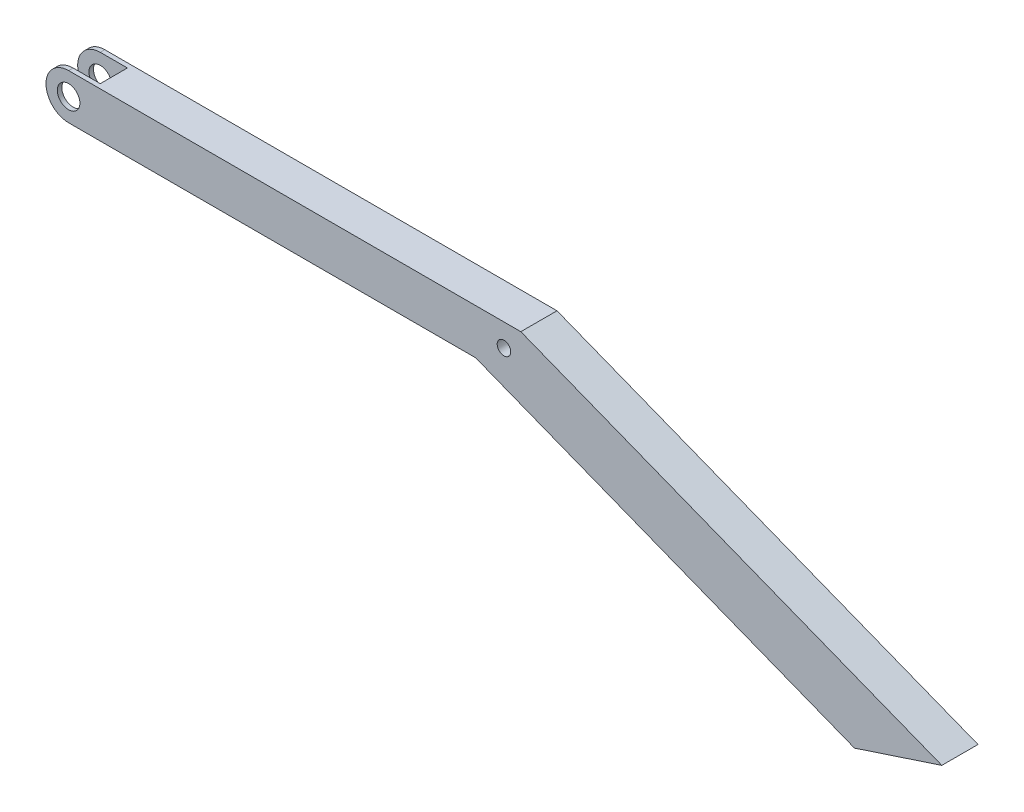
ISO-10303-21;
HEADER;
FILE_DESCRIPTION(('STEP AP214'),'2;1');
FILE_NAME('part.step','',(''),(''),'','','');
FILE_SCHEMA(('AUTOMOTIVE_DESIGN { 1 0 10303 214 1 1 1 1 }'));
ENDSEC;
DATA;
#1=APPLICATION_CONTEXT('core data for automotive mechanical design processes');
#2=APPLICATION_PROTOCOL_DEFINITION('international standard','automotive_design',2000,#1);
#3=PRODUCT_CONTEXT('',#1,'mechanical');
#4=PRODUCT('Part','Part','',(#3));
#5=PRODUCT_RELATED_PRODUCT_CATEGORY('part','',(#4));
#6=PRODUCT_DEFINITION_FORMATION('','',#4);
#7=PRODUCT_DEFINITION_CONTEXT('part definition',#1,'design');
#8=PRODUCT_DEFINITION('design','',#6,#7);
#9=PRODUCT_DEFINITION_SHAPE('','',#8);
#10=(LENGTH_UNIT() NAMED_UNIT(*) SI_UNIT(.MILLI.,.METRE.));
#11=(NAMED_UNIT(*) PLANE_ANGLE_UNIT() SI_UNIT($,.RADIAN.));
#12=(NAMED_UNIT(*) SI_UNIT($,.STERADIAN.) SOLID_ANGLE_UNIT());
#13=UNCERTAINTY_MEASURE_WITH_UNIT(LENGTH_MEASURE(1.E-05),#10,'distance_accuracy_value','');
#14=(GEOMETRIC_REPRESENTATION_CONTEXT(3) GLOBAL_UNCERTAINTY_ASSIGNED_CONTEXT((#13)) GLOBAL_UNIT_ASSIGNED_CONTEXT((#10,
#11,#12)) REPRESENTATION_CONTEXT('',''));
#15=CARTESIAN_POINT('',(0.,0.,0.));
#16=DIRECTION('',(0.,0.,1.));
#17=DIRECTION('',(1.,0.,0.));
#18=AXIS2_PLACEMENT_3D('',#15,#16,#17);
#19=CARTESIAN_POINT('',(-83.2313575525812,9.56022944550669,4.));
#20=DIRECTION('',(0.,0.,-1.));
#21=DIRECTION('',(-1.,0.,0.));
#22=AXIS2_PLACEMENT_3D('',#19,#20,#21);
#23=CYLINDRICAL_SURFACE('',#22,5.);
#24=CARTESIAN_POINT('',(-83.2313575525812,9.56022944550669,-3.));
#25=DIRECTION('',(0.,0.,1.));
#26=DIRECTION('',(1.,0.,0.));
#27=AXIS2_PLACEMENT_3D('',#24,#25,#26);
#28=CIRCLE('',#27,5.);
#29=CARTESIAN_POINT('',(-83.2313575525812,14.5602294455067,-3.));
#30=VERTEX_POINT('',#29);
#31=CARTESIAN_POINT('',(-83.2313575525812,4.56022944550669,-3.));
#32=VERTEX_POINT('',#31);
#33=EDGE_CURVE('E225',#30,#32,#28,.T.);
#34=ORIENTED_EDGE('',*,*,#33,.F.);
#35=DIRECTION('',(0.,0.,-1.));
#36=VECTOR('',#35,1.);
#37=CARTESIAN_POINT('',(-83.2313575525812,14.5602294455067,4.));
#38=LINE('',#37,#36);
#39=CARTESIAN_POINT('',(-83.2313575525812,14.5602294455067,-4.));
#40=VERTEX_POINT('',#39);
#41=EDGE_CURVE('E93',#30,#40,#38,.T.);
#42=ORIENTED_EDGE('',*,*,#41,.T.);
#43=CARTESIAN_POINT('',(-83.2313575525812,9.56022944550669,-4.));
#44=DIRECTION('',(0.,0.,1.));
#45=DIRECTION('',(1.,0.,0.));
#46=AXIS2_PLACEMENT_3D('',#43,#44,#45);
#47=CIRCLE('',#46,5.);
#48=CARTESIAN_POINT('',(-83.2313575525812,4.56022944550669,-4.));
#49=VERTEX_POINT('',#48);
#50=EDGE_CURVE('E141',#40,#49,#47,.T.);
#51=ORIENTED_EDGE('',*,*,#50,.T.);
#52=DIRECTION('',(0.,0.,-1.));
#53=VECTOR('',#52,1.);
#54=CARTESIAN_POINT('',(-83.2313575525812,4.56022944550669,4.));
#55=LINE('',#54,#53);
#56=EDGE_CURVE('E48',#32,#49,#55,.T.);
#57=ORIENTED_EDGE('',*,*,#56,.F.);
#58=EDGE_LOOP('',(#34,#42,#51,#57));
#59=FACE_BOUND('',#58,.T.);
#60=ADVANCED_FACE('F39',(#59),#23,.T.);
#61=CARTESIAN_POINT('',(-43.2313575525813,4.56022944550669,4.));
#62=DIRECTION('',(0.,1.,0.));
#63=DIRECTION('',(0.,0.,1.));
#64=AXIS2_PLACEMENT_3D('',#61,#62,#63);
#65=PLANE('',#64);
#66=DIRECTION('',(1.,0.,0.));
#67=VECTOR('',#66,1.);
#68=CARTESIAN_POINT('',(-83.2313575525812,4.56022944550669,-3.));
#69=LINE('',#68,#67);
#70=CARTESIAN_POINT('',(-77.2313575525813,4.5602294455067,-3.));
#71=VERTEX_POINT('',#70);
#72=EDGE_CURVE('E232',#32,#71,#69,.T.);
#73=ORIENTED_EDGE('',*,*,#72,.F.);
#74=ORIENTED_EDGE('',*,*,#56,.T.);
#75=DIRECTION('',(1.,0.,0.));
#76=VECTOR('',#75,1.);
#77=CARTESIAN_POINT('',(-43.2313575525813,4.56022944550669,-4.));
#78=LINE('',#77,#76);
#79=CARTESIAN_POINT('',(6.76864244741875,4.56022944550669,-4.));
#80=VERTEX_POINT('',#79);
#81=EDGE_CURVE('E143',#49,#80,#78,.T.);
#82=ORIENTED_EDGE('',*,*,#81,.T.);
#83=DIRECTION('',(0.,0.,-1.));
#84=VECTOR('',#83,1.);
#85=CARTESIAN_POINT('',(6.76864244741875,4.56022944550669,4.));
#86=LINE('',#85,#84);
#87=CARTESIAN_POINT('',(6.76864244741875,4.56022944550669,4.));
#88=VERTEX_POINT('',#87);
#89=EDGE_CURVE('E159',#88,#80,#86,.T.);
#90=ORIENTED_EDGE('',*,*,#89,.F.);
#91=DIRECTION('',(1.,0.,0.));
#92=VECTOR('',#91,1.);
#93=CARTESIAN_POINT('',(-83.2313575525812,4.56022944550669,4.));
#94=LINE('',#93,#92);
#95=CARTESIAN_POINT('',(-83.2313575525812,4.56022944550669,4.));
#96=VERTEX_POINT('',#95);
#97=EDGE_CURVE('E101',#96,#88,#94,.T.);
#98=ORIENTED_EDGE('',*,*,#97,.F.);
#99=CARTESIAN_POINT('',(-83.2313575525812,4.56022944550669,3.));
#100=VERTEX_POINT('',#99);
#101=EDGE_CURVE('E11',#96,#100,#55,.T.);
#102=ORIENTED_EDGE('',*,*,#101,.T.);
#103=DIRECTION('',(1.,0.,0.));
#104=VECTOR('',#103,1.);
#105=CARTESIAN_POINT('',(-83.2313575525812,4.56022944550669,3.));
#106=LINE('',#105,#104);
#107=CARTESIAN_POINT('',(-77.2313575525813,4.5602294455067,3.));
#108=VERTEX_POINT('',#107);
#109=EDGE_CURVE('E210',#100,#108,#106,.T.);
#110=ORIENTED_EDGE('',*,*,#109,.T.);
#111=DIRECTION('',(0.,0.,1.));
#112=VECTOR('',#111,1.);
#113=CARTESIAN_POINT('',(-77.2313575525813,4.5602294455067,-3.));
#114=LINE('',#113,#112);
#115=EDGE_CURVE('E169',#71,#108,#114,.T.);
#116=ORIENTED_EDGE('',*,*,#115,.F.);
#117=EDGE_LOOP('',(#73,#74,#82,#90,#98,#102,#110,#116));
#118=FACE_BOUND('',#117,.T.);
#119=ADVANCED_FACE('F195',(#118),#65,.F.);
#120=CARTESIAN_POINT('',(-83.2313575525812,14.5602294455067,4.));
#121=DIRECTION('',(0.,-1.,0.));
#122=DIRECTION('',(0.,0.,-1.));
#123=AXIS2_PLACEMENT_3D('',#120,#121,#122);
#124=PLANE('',#123);
#125=DIRECTION('',(-1.,0.,0.));
#126=VECTOR('',#125,1.);
#127=CARTESIAN_POINT('',(-83.2313575525812,14.5602294455067,-3.));
#128=LINE('',#127,#126);
#129=CARTESIAN_POINT('',(-77.2313575525813,14.5602294455067,-3.));
#130=VERTEX_POINT('',#129);
#131=EDGE_CURVE('E175',#130,#30,#128,.T.);
#132=ORIENTED_EDGE('',*,*,#131,.F.);
#133=DIRECTION('',(0.,0.,1.));
#134=VECTOR('',#133,1.);
#135=CARTESIAN_POINT('',(-77.2313575525813,14.5602294455067,-3.));
#136=LINE('',#135,#134);
#137=CARTESIAN_POINT('',(-77.2313575525813,14.5602294455067,3.));
#138=VERTEX_POINT('',#137);
#139=EDGE_CURVE('E163',#130,#138,#136,.T.);
#140=ORIENTED_EDGE('',*,*,#139,.T.);
#141=DIRECTION('',(-1.,0.,0.));
#142=VECTOR('',#141,1.);
#143=CARTESIAN_POINT('',(-83.2313575525812,14.5602294455067,3.));
#144=LINE('',#143,#142);
#145=CARTESIAN_POINT('',(-83.2313575525812,14.5602294455067,3.));
#146=VERTEX_POINT('',#145);
#147=EDGE_CURVE('E178',#138,#146,#144,.T.);
#148=ORIENTED_EDGE('',*,*,#147,.T.);
#149=CARTESIAN_POINT('',(-83.2313575525812,14.5602294455067,4.));
#150=VERTEX_POINT('',#149);
#151=EDGE_CURVE('E154',#150,#146,#38,.T.);
#152=ORIENTED_EDGE('',*,*,#151,.F.);
#153=DIRECTION('',(-1.,0.,0.));
#154=VECTOR('',#153,1.);
#155=CARTESIAN_POINT('',(-43.2313575525813,14.5602294455067,4.));
#156=LINE('',#155,#154);
#157=CARTESIAN_POINT('',(16.7686424474187,14.5602294455067,4.));
#158=VERTEX_POINT('',#157);
#159=EDGE_CURVE('E65',#158,#150,#156,.T.);
#160=ORIENTED_EDGE('',*,*,#159,.F.);
#161=DIRECTION('',(0.,0.,-1.));
#162=VECTOR('',#161,1.);
#163=CARTESIAN_POINT('',(16.7686424474187,14.5602294455067,4.));
#164=LINE('',#163,#162);
#165=CARTESIAN_POINT('',(16.7686424474187,14.5602294455067,-4.));
#166=VERTEX_POINT('',#165);
#167=EDGE_CURVE('E133',#158,#166,#164,.T.);
#168=ORIENTED_EDGE('',*,*,#167,.T.);
#169=DIRECTION('',(-1.,0.,0.));
#170=VECTOR('',#169,1.);
#171=CARTESIAN_POINT('',(-83.2313575525812,14.5602294455067,-4.));
#172=LINE('',#171,#170);
#173=EDGE_CURVE('E151',#166,#40,#172,.T.);
#174=ORIENTED_EDGE('',*,*,#173,.T.);
#175=ORIENTED_EDGE('',*,*,#41,.F.);
#176=EDGE_LOOP('',(#132,#140,#148,#152,#160,#168,#174,#175));
#177=FACE_BOUND('',#176,.T.);
#178=ADVANCED_FACE('F204',(#177),#124,.F.);
#179=CARTESIAN_POINT('',(-83.2313575525812,9.56022944550669,4.));
#180=DIRECTION('',(0.,0.,-1.));
#181=DIRECTION('',(-1.,0.,0.));
#182=AXIS2_PLACEMENT_3D('',#179,#180,#181);
#183=CYLINDRICAL_SURFACE('',#182,2.49999999999999);
#184=CARTESIAN_POINT('',(-83.2313575525812,9.56022944550669,-4.));
#185=DIRECTION('',(0.,0.,1.));
#186=DIRECTION('',(1.,0.,0.));
#187=AXIS2_PLACEMENT_3D('',#184,#185,#186);
#188=CIRCLE('',#187,2.49999999999999);
#189=CARTESIAN_POINT('',(-80.7313575525813,9.56022944550669,-4.));
#190=VERTEX_POINT('',#189);
#191=EDGE_CURVE('E167',#190,#190,#188,.T.);
#192=ORIENTED_EDGE('',*,*,#191,.F.);
#193=EDGE_LOOP('',(#192));
#194=FACE_BOUND('',#193,.T.);
#195=CARTESIAN_POINT('',(-83.2313575525812,9.56022944550669,-3.));
#196=DIRECTION('',(0.,0.,1.));
#197=DIRECTION('',(1.,0.,0.));
#198=AXIS2_PLACEMENT_3D('',#195,#196,#197);
#199=CIRCLE('',#198,2.49999999999999);
#200=CARTESIAN_POINT('',(-80.7313575525813,9.56022944550669,-3.));
#201=VERTEX_POINT('',#200);
#202=EDGE_CURVE('E43',#201,#201,#199,.T.);
#203=ORIENTED_EDGE('',*,*,#202,.T.);
#204=EDGE_LOOP('',(#203));
#205=FACE_BOUND('',#204,.T.);
#206=ADVANCED_FACE('F259',(#194,#205),#183,.F.);
#207=CARTESIAN_POINT('',(-83.2313575525812,9.56022944550669,4.));
#208=DIRECTION('',(0.,0.,1.));
#209=DIRECTION('',(1.,0.,0.));
#210=AXIS2_PLACEMENT_3D('',#207,#208,#209);
#211=PLANE('',#210);
#212=CARTESIAN_POINT('',(13.0411471268133,9.56022944550669,4.));
#213=DIRECTION('',(0.,0.,1.));
#214=DIRECTION('',(1.,0.,0.));
#215=AXIS2_PLACEMENT_3D('',#212,#213,#214);
#216=CIRCLE('',#215,1.5);
#217=CARTESIAN_POINT('',(14.5411471268133,9.56022944550669,4.));
#218=VERTEX_POINT('',#217);
#219=EDGE_CURVE('E144',#218,#218,#216,.T.);
#220=ORIENTED_EDGE('',*,*,#219,.F.);
#221=EDGE_LOOP('',(#220));
#222=FACE_BOUND('',#221,.T.);
#223=CARTESIAN_POINT('',(-83.2313575525812,9.56022944550669,4.));
#224=DIRECTION('',(0.,0.,1.));
#225=DIRECTION('',(1.,0.,0.));
#226=AXIS2_PLACEMENT_3D('',#223,#224,#225);
#227=CIRCLE('',#226,5.);
#228=EDGE_CURVE('E153',#150,#96,#227,.T.);
#229=ORIENTED_EDGE('',*,*,#228,.T.);
#230=ORIENTED_EDGE('',*,*,#97,.T.);
#231=DIRECTION('',(0.930964273643458,-0.365110286351274,0.));
#232=VECTOR('',#231,1.);
#233=CARTESIAN_POINT('',(6.76864244741875,4.56022944550669,4.));
#234=LINE('',#233,#232);
#235=CARTESIAN_POINT('',(90.5554270753299,-28.299696326108,4.));
#236=VERTEX_POINT('',#235);
#237=EDGE_CURVE('E119',#88,#236,#234,.T.);
#238=ORIENTED_EDGE('',*,*,#237,.T.);
#239=DIRECTION('',(0.949968991420898,0.312344225717014,0.));
#240=VECTOR('',#239,1.);
#241=CARTESIAN_POINT('',(109.865069811765,-21.9507991896207,4.));
#242=LINE('',#241,#240);
#243=CARTESIAN_POINT('',(109.865069811765,-21.9507991896207,4.));
#244=VERTEX_POINT('',#243);
#245=EDGE_CURVE('E111',#236,#244,#242,.T.);
#246=ORIENTED_EDGE('',*,*,#245,.T.);
#247=DIRECTION('',(-0.930964273643458,0.365110286351274,0.));
#248=VECTOR('',#247,1.);
#249=CARTESIAN_POINT('',(16.7686424474187,14.5602294455067,4.));
#250=LINE('',#249,#248);
#251=EDGE_CURVE('E116',#244,#158,#250,.T.);
#252=ORIENTED_EDGE('',*,*,#251,.T.);
#253=ORIENTED_EDGE('',*,*,#159,.T.);
#254=EDGE_LOOP('',(#229,#230,#238,#246,#252,#253));
#255=FACE_BOUND('',#254,.T.);
#256=CARTESIAN_POINT('',(-83.2313575525812,9.56022944550669,4.));
#257=DIRECTION('',(0.,0.,1.));
#258=DIRECTION('',(1.,0.,0.));
#259=AXIS2_PLACEMENT_3D('',#256,#257,#258);
#260=CIRCLE('',#259,2.49999999999999);
#261=CARTESIAN_POINT('',(-80.7313575525813,9.56022944550669,4.));
#262=VERTEX_POINT('',#261);
#263=EDGE_CURVE('E181',#262,#262,#260,.T.);
#264=ORIENTED_EDGE('',*,*,#263,.F.);
#265=EDGE_LOOP('',(#264));
#266=FACE_BOUND('',#265,.T.);
#267=ADVANCED_FACE('F113',(#222,#255,#266),#211,.T.);
#268=CARTESIAN_POINT('',(-83.2313575525812,9.56022944550669,-4.));
#269=DIRECTION('',(0.,0.,1.));
#270=DIRECTION('',(1.,0.,0.));
#271=AXIS2_PLACEMENT_3D('',#268,#269,#270);
#272=PLANE('',#271);
#273=ORIENTED_EDGE('',*,*,#50,.F.);
#274=ORIENTED_EDGE('',*,*,#173,.F.);
#275=DIRECTION('',(-0.930964273643458,0.365110286351274,0.));
#276=VECTOR('',#275,1.);
#277=CARTESIAN_POINT('',(16.7686424474187,14.5602294455067,-4.));
#278=LINE('',#277,#276);
#279=CARTESIAN_POINT('',(109.865069811765,-21.9507991896207,-4.));
#280=VERTEX_POINT('',#279);
#281=EDGE_CURVE('E149',#280,#166,#278,.T.);
#282=ORIENTED_EDGE('',*,*,#281,.F.);
#283=DIRECTION('',(0.949968991420898,0.312344225717014,0.));
#284=VECTOR('',#283,1.);
#285=CARTESIAN_POINT('',(109.865069811765,-21.9507991896207,-4.));
#286=LINE('',#285,#284);
#287=CARTESIAN_POINT('',(90.5554270753299,-28.299696326108,-4.));
#288=VERTEX_POINT('',#287);
#289=EDGE_CURVE('E128',#288,#280,#286,.T.);
#290=ORIENTED_EDGE('',*,*,#289,.F.);
#291=DIRECTION('',(0.930964273643458,-0.365110286351274,0.));
#292=VECTOR('',#291,1.);
#293=CARTESIAN_POINT('',(6.76864244741875,4.56022944550669,-4.));
#294=LINE('',#293,#292);
#295=EDGE_CURVE('E146',#80,#288,#294,.T.);
#296=ORIENTED_EDGE('',*,*,#295,.F.);
#297=ORIENTED_EDGE('',*,*,#81,.F.);
#298=EDGE_LOOP('',(#273,#274,#282,#290,#296,#297));
#299=FACE_BOUND('',#298,.T.);
#300=CARTESIAN_POINT('',(13.0411471268133,9.56022944550669,-4.));
#301=DIRECTION('',(0.,0.,1.));
#302=DIRECTION('',(1.,0.,0.));
#303=AXIS2_PLACEMENT_3D('',#300,#301,#302);
#304=CIRCLE('',#303,1.5);
#305=CARTESIAN_POINT('',(14.5411471268133,9.56022944550669,-4.));
#306=VERTEX_POINT('',#305);
#307=EDGE_CURVE('E184',#306,#306,#304,.T.);
#308=ORIENTED_EDGE('',*,*,#307,.T.);
#309=EDGE_LOOP('',(#308));
#310=FACE_BOUND('',#309,.T.);
#311=ORIENTED_EDGE('',*,*,#191,.T.);
#312=EDGE_LOOP('',(#311));
#313=FACE_BOUND('',#312,.T.);
#314=ADVANCED_FACE('F202',(#299,#310,#313),#272,.F.);
#315=ORIENTED_EDGE('',*,*,#151,.T.);
#316=CARTESIAN_POINT('',(-83.2313575525812,9.56022944550669,3.));
#317=DIRECTION('',(0.,0.,1.));
#318=DIRECTION('',(1.,0.,0.));
#319=AXIS2_PLACEMENT_3D('',#316,#317,#318);
#320=CIRCLE('',#319,5.);
#321=EDGE_CURVE('E56',#146,#100,#320,.T.);
#322=ORIENTED_EDGE('',*,*,#321,.T.);
#323=ORIENTED_EDGE('',*,*,#101,.F.);
#324=ORIENTED_EDGE('',*,*,#228,.F.);
#325=EDGE_LOOP('',(#315,#322,#323,#324));
#326=FACE_BOUND('',#325,.T.);
#327=ADVANCED_FACE('F41',(#326),#23,.T.);
#328=CARTESIAN_POINT('',(6.76864244741875,4.56022944550669,4.));
#329=DIRECTION('',(0.365110286351274,0.930964273643458,0.));
#330=DIRECTION('',(-0.930964273643458,0.365110286351274,0.));
#331=AXIS2_PLACEMENT_3D('',#328,#329,#330);
#332=PLANE('',#331);
#333=ORIENTED_EDGE('',*,*,#295,.T.);
#334=DIRECTION('',(0.,0.,-1.));
#335=VECTOR('',#334,1.);
#336=CARTESIAN_POINT('',(90.5554270753299,-28.299696326108,4.));
#337=LINE('',#336,#335);
#338=EDGE_CURVE('E132',#236,#288,#337,.T.);
#339=ORIENTED_EDGE('',*,*,#338,.F.);
#340=ORIENTED_EDGE('',*,*,#237,.F.);
#341=ORIENTED_EDGE('',*,*,#89,.T.);
#342=EDGE_LOOP('',(#333,#339,#340,#341));
#343=FACE_BOUND('',#342,.T.);
#344=ADVANCED_FACE('F199',(#343),#332,.F.);
#345=CARTESIAN_POINT('',(109.865069811765,-21.9507991896207,4.));
#346=DIRECTION('',(-0.312344225717014,0.949968991420898,0.));
#347=DIRECTION('',(-0.949968991420898,-0.312344225717014,0.));
#348=AXIS2_PLACEMENT_3D('',#345,#346,#347);
#349=PLANE('',#348);
#350=ORIENTED_EDGE('',*,*,#289,.T.);
#351=DIRECTION('',(0.,0.,-1.));
#352=VECTOR('',#351,1.);
#353=CARTESIAN_POINT('',(109.865069811765,-21.9507991896207,4.));
#354=LINE('',#353,#352);
#355=EDGE_CURVE('E125',#244,#280,#354,.T.);
#356=ORIENTED_EDGE('',*,*,#355,.F.);
#357=ORIENTED_EDGE('',*,*,#245,.F.);
#358=ORIENTED_EDGE('',*,*,#338,.T.);
#359=EDGE_LOOP('',(#350,#356,#357,#358));
#360=FACE_BOUND('',#359,.T.);
#361=ADVANCED_FACE('F126',(#360),#349,.F.);
#362=CARTESIAN_POINT('',(16.7686424474187,14.5602294455067,4.));
#363=DIRECTION('',(-0.365110286351274,-0.930964273643458,0.));
#364=DIRECTION('',(0.930964273643458,-0.365110286351274,0.));
#365=AXIS2_PLACEMENT_3D('',#362,#363,#364);
#366=PLANE('',#365);
#367=ORIENTED_EDGE('',*,*,#281,.T.);
#368=ORIENTED_EDGE('',*,*,#167,.F.);
#369=ORIENTED_EDGE('',*,*,#251,.F.);
#370=ORIENTED_EDGE('',*,*,#355,.T.);
#371=EDGE_LOOP('',(#367,#368,#369,#370));
#372=FACE_BOUND('',#371,.T.);
#373=ADVANCED_FACE('F135',(#372),#366,.F.);
#374=CARTESIAN_POINT('',(13.0411471268133,9.56022944550669,4.));
#375=DIRECTION('',(0.,0.,-1.));
#376=DIRECTION('',(-1.,0.,0.));
#377=AXIS2_PLACEMENT_3D('',#374,#375,#376);
#378=CYLINDRICAL_SURFACE('',#377,1.5);
#379=ORIENTED_EDGE('',*,*,#219,.T.);
#380=EDGE_LOOP('',(#379));
#381=FACE_BOUND('',#380,.T.);
#382=ORIENTED_EDGE('',*,*,#307,.F.);
#383=EDGE_LOOP('',(#382));
#384=FACE_BOUND('',#383,.T.);
#385=ADVANCED_FACE('F268',(#381,#384),#378,.F.);
#386=CARTESIAN_POINT('',(-83.2313575525812,9.56022944550669,3.));
#387=DIRECTION('',(0.,0.,1.));
#388=DIRECTION('',(1.,0.,0.));
#389=AXIS2_PLACEMENT_3D('',#386,#387,#388);
#390=CIRCLE('',#389,2.49999999999999);
#391=CARTESIAN_POINT('',(-80.7313575525813,9.56022944550669,3.));
#392=VERTEX_POINT('',#391);
#393=EDGE_CURVE('E161',#392,#392,#390,.T.);
#394=ORIENTED_EDGE('',*,*,#393,.F.);
#395=EDGE_LOOP('',(#394));
#396=FACE_BOUND('',#395,.T.);
#397=ORIENTED_EDGE('',*,*,#263,.T.);
#398=EDGE_LOOP('',(#397));
#399=FACE_BOUND('',#398,.T.);
#400=ADVANCED_FACE('F284',(#396,#399),#183,.F.);
#401=CARTESIAN_POINT('',(-77.2313575525813,14.5602294455067,-3.));
#402=DIRECTION('',(1.,0.,0.));
#403=DIRECTION('',(0.,0.,-1.));
#404=AXIS2_PLACEMENT_3D('',#401,#402,#403);
#405=PLANE('',#404);
#406=DIRECTION('',(0.,1.,0.));
#407=VECTOR('',#406,1.);
#408=CARTESIAN_POINT('',(-77.2313575525813,14.5602294455067,3.));
#409=LINE('',#408,#407);
#410=EDGE_CURVE('E228',#108,#138,#409,.T.);
#411=ORIENTED_EDGE('',*,*,#410,.T.);
#412=ORIENTED_EDGE('',*,*,#139,.F.);
#413=DIRECTION('',(0.,1.,0.));
#414=VECTOR('',#413,1.);
#415=CARTESIAN_POINT('',(-77.2313575525813,14.5602294455067,-3.));
#416=LINE('',#415,#414);
#417=EDGE_CURVE('E234',#71,#130,#416,.T.);
#418=ORIENTED_EDGE('',*,*,#417,.F.);
#419=ORIENTED_EDGE('',*,*,#115,.T.);
#420=EDGE_LOOP('',(#411,#412,#418,#419));
#421=FACE_BOUND('',#420,.T.);
#422=ADVANCED_FACE('F229',(#421),#405,.F.);
#423=CARTESIAN_POINT('',(-83.2313575525812,9.56022944550669,-3.));
#424=DIRECTION('',(0.,0.,1.));
#425=DIRECTION('',(1.,0.,0.));
#426=AXIS2_PLACEMENT_3D('',#423,#424,#425);
#427=PLANE('',#426);
#428=ORIENTED_EDGE('',*,*,#202,.F.);
#429=EDGE_LOOP('',(#428));
#430=FACE_BOUND('',#429,.T.);
#431=ORIENTED_EDGE('',*,*,#33,.T.);
#432=ORIENTED_EDGE('',*,*,#72,.T.);
#433=ORIENTED_EDGE('',*,*,#417,.T.);
#434=ORIENTED_EDGE('',*,*,#131,.T.);
#435=EDGE_LOOP('',(#431,#432,#433,#434));
#436=FACE_BOUND('',#435,.T.);
#437=ADVANCED_FACE('F240',(#430,#436),#427,.T.);
#438=CARTESIAN_POINT('',(-83.2313575525812,9.56022944550669,3.));
#439=DIRECTION('',(0.,0.,1.));
#440=DIRECTION('',(1.,0.,0.));
#441=AXIS2_PLACEMENT_3D('',#438,#439,#440);
#442=PLANE('',#441);
#443=ORIENTED_EDGE('',*,*,#393,.T.);
#444=EDGE_LOOP('',(#443));
#445=FACE_BOUND('',#444,.T.);
#446=ORIENTED_EDGE('',*,*,#321,.F.);
#447=ORIENTED_EDGE('',*,*,#147,.F.);
#448=ORIENTED_EDGE('',*,*,#410,.F.);
#449=ORIENTED_EDGE('',*,*,#109,.F.);
#450=EDGE_LOOP('',(#446,#447,#448,#449));
#451=FACE_BOUND('',#450,.T.);
#452=ADVANCED_FACE('F231',(#445,#451),#442,.F.);
#453=CLOSED_SHELL('',(#60,#119,#178,#206,#267,#314,#327,#344,#361,#373,#385,#400,#422,#437,#452));
#454=MANIFOLD_SOLID_BREP('B2',#453);
#455=ADVANCED_BREP_SHAPE_REPRESENTATION('',(#18,#454),#14);
#456=SHAPE_DEFINITION_REPRESENTATION(#9,#455);
ENDSEC;
END-ISO-10303-21;
